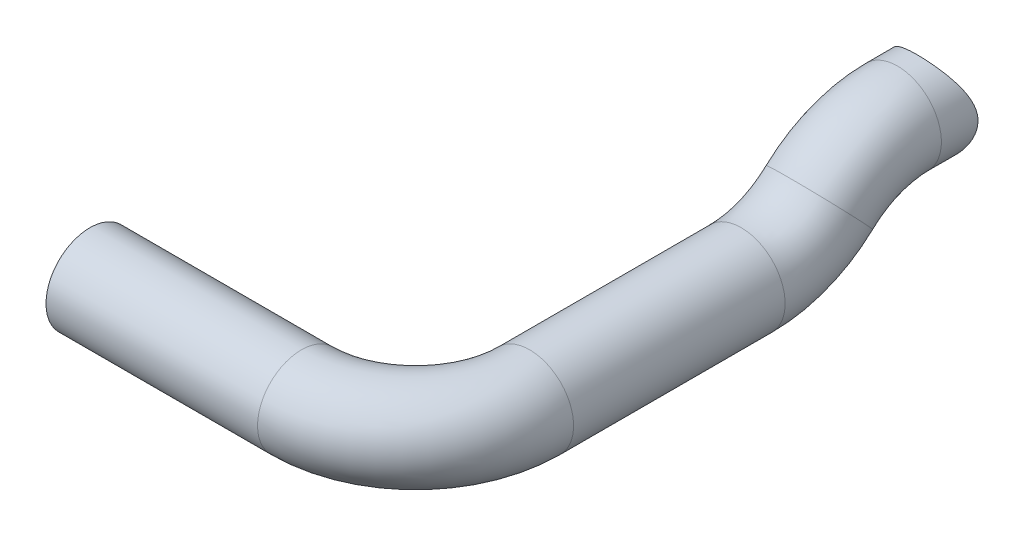
ISO-10303-21;
HEADER;
FILE_DESCRIPTION(('STEP AP214'),'2;1');
FILE_NAME('part.step','',(''),(''),'','','');
FILE_SCHEMA(('AUTOMOTIVE_DESIGN { 1 0 10303 214 1 1 1 1 }'));
ENDSEC;
DATA;
#1=APPLICATION_CONTEXT('core data for automotive mechanical design processes');
#2=APPLICATION_PROTOCOL_DEFINITION('international standard','automotive_design',2000,#1);
#3=PRODUCT_CONTEXT('',#1,'mechanical');
#4=PRODUCT('Part','Part','',(#3));
#5=PRODUCT_RELATED_PRODUCT_CATEGORY('part','',(#4));
#6=PRODUCT_DEFINITION_FORMATION('','',#4);
#7=PRODUCT_DEFINITION_CONTEXT('part definition',#1,'design');
#8=PRODUCT_DEFINITION('design','',#6,#7);
#9=PRODUCT_DEFINITION_SHAPE('','',#8);
#10=(LENGTH_UNIT() NAMED_UNIT(*) SI_UNIT(.MILLI.,.METRE.));
#11=(NAMED_UNIT(*) PLANE_ANGLE_UNIT() SI_UNIT($,.RADIAN.));
#12=(NAMED_UNIT(*) SI_UNIT($,.STERADIAN.) SOLID_ANGLE_UNIT());
#13=UNCERTAINTY_MEASURE_WITH_UNIT(LENGTH_MEASURE(1.E-05),#10,'distance_accuracy_value','');
#14=(GEOMETRIC_REPRESENTATION_CONTEXT(3) GLOBAL_UNCERTAINTY_ASSIGNED_CONTEXT((#13)) GLOBAL_UNIT_ASSIGNED_CONTEXT((#10,
#11,#12)) REPRESENTATION_CONTEXT('',''));
#15=CARTESIAN_POINT('',(0.,0.,0.));
#16=DIRECTION('',(0.,0.,1.));
#17=DIRECTION('',(1.,0.,0.));
#18=AXIS2_PLACEMENT_3D('',#15,#16,#17);
#19=CARTESIAN_POINT('',(114.1966666667,0.913,-12.8));
#20=DIRECTION('',(-1.,0.,0.));
#21=DIRECTION('',(0.,0.,1.));
#22=AXIS2_PLACEMENT_3D('',#19,#20,#21);
#23=PLANE('',#22);
#24=CARTESIAN_POINT('',(114.1966666667,0.913,-12.8));
#25=DIRECTION('',(-1.,0.,0.));
#26=DIRECTION('',(0.,0.,1.));
#27=AXIS2_PLACEMENT_3D('',#24,#25,#26);
#28=CIRCLE('',#27,0.83);
#29=CARTESIAN_POINT('',(114.1966666667,0.913,-11.97));
#30=VERTEX_POINT('',#29);
#31=EDGE_CURVE('E11',#30,#30,#28,.T.);
#32=ORIENTED_EDGE('',*,*,#31,.T.);
#33=EDGE_LOOP('',(#32));
#34=FACE_BOUND('',#33,.T.);
#35=ADVANCED_FACE('F17',(#34),#23,.T.);
#36=CARTESIAN_POINT('',(116.1966666667,0.913,-12.8));
#37=DIRECTION('',(1.,0.,0.));
#38=DIRECTION('',(0.,0.,-1.));
#39=AXIS2_PLACEMENT_3D('',#36,#37,#38);
#40=CYLINDRICAL_SURFACE('',#39,0.83);
#41=CARTESIAN_POINT('',(118.1966666667,0.913,-12.8));
#42=DIRECTION('',(1.,0.,0.));
#43=DIRECTION('',(0.,0.,1.));
#44=AXIS2_PLACEMENT_3D('',#41,#42,#43);
#45=CIRCLE('',#44,0.83);
#46=CARTESIAN_POINT('',(118.1966666667,0.913,-13.63));
#47=VERTEX_POINT('',#46);
#48=CARTESIAN_POINT('',(118.1966666667,0.913,-11.97));
#49=VERTEX_POINT('',#48);
#50=EDGE_CURVE('E129',#47,#49,#45,.T.);
#51=ORIENTED_EDGE('',*,*,#50,.F.);
#52=CARTESIAN_POINT('',(118.1966666667,0.913,-12.8));
#53=DIRECTION('',(1.,0.,0.));
#54=DIRECTION('',(0.,0.,1.));
#55=AXIS2_PLACEMENT_3D('',#52,#53,#54);
#56=CIRCLE('',#55,0.83);
#57=EDGE_CURVE('E92',#49,#47,#56,.T.);
#58=ORIENTED_EDGE('',*,*,#57,.F.);
#59=DIRECTION('',(-1.,0.,0.));
#60=VECTOR('',#59,1.);
#61=CARTESIAN_POINT('',(116.1966666667,0.913,-11.97));
#62=LINE('',#61,#60);
#63=EDGE_CURVE('E28',#49,#30,#62,.T.);
#64=ORIENTED_EDGE('',*,*,#63,.T.);
#65=ORIENTED_EDGE('',*,*,#31,.F.);
#66=ORIENTED_EDGE('',*,*,#63,.F.);
#67=EDGE_LOOP('',(#51,#58,#64,#65,#66));
#68=FACE_BOUND('',#67,.T.);
#69=ADVANCED_FACE('F208',(#68),#40,.T.);
#70=CARTESIAN_POINT('',(118.1966666667,0.913,-14.958));
#71=DIRECTION('',(0.,-1.,0.));
#72=DIRECTION('',(0.,0.,-1.));
#73=AXIS2_PLACEMENT_3D('',#70,#71,#72);
#74=TOROIDAL_SURFACE('',#73,2.158,0.83);
#75=ORIENTED_EDGE('',*,*,#50,.T.);
#76=ORIENTED_EDGE('',*,*,#57,.T.);
#77=CARTESIAN_POINT('',(118.1966666667,0.913,-14.958));
#78=DIRECTION('',(0.,1.,0.));
#79=DIRECTION('',(0.,0.,-1.));
#80=AXIS2_PLACEMENT_3D('',#77,#78,#79);
#81=CIRCLE('',#80,1.328);
#82=CARTESIAN_POINT('',(119.5246666667,0.913,-14.958));
#83=VERTEX_POINT('',#82);
#84=EDGE_CURVE('E86',#47,#83,#81,.T.);
#85=ORIENTED_EDGE('',*,*,#84,.T.);
#86=CARTESIAN_POINT('',(120.3546666667,0.913,-14.958));
#87=DIRECTION('',(0.,0.,1.));
#88=DIRECTION('',(0.,-1.,0.));
#89=AXIS2_PLACEMENT_3D('',#86,#87,#88);
#90=CIRCLE('',#89,0.83);
#91=EDGE_CURVE('E91',#83,#83,#90,.T.);
#92=ORIENTED_EDGE('',*,*,#91,.T.);
#93=ORIENTED_EDGE('',*,*,#84,.F.);
#94=EDGE_LOOP('',(#75,#76,#85,#92,#93));
#95=FACE_BOUND('',#94,.T.);
#96=ADVANCED_FACE('F89',(#95),#74,.T.);
#97=CARTESIAN_POINT('',(120.3546666667,2.253,-23.51274872028));
#98=DIRECTION('',(0.,-1.,0.));
#99=DIRECTION('',(1.,0.,0.));
#100=AXIS2_PLACEMENT_3D('',#97,#98,#99);
#101=CYLINDRICAL_SURFACE('',#100,1.23);
#102=CARTESIAN_POINT('',(121.1846666667,2.083,-22.6050042628472));
#103=CARTESIAN_POINT('',(121.184662738499,2.07622727715432,-22.6050007577028));
#104=CARTESIAN_POINT('',(121.184577446457,2.06945463501066,-22.6049226870863));
#105=CARTESIAN_POINT('',(121.184244006698,2.05592070960233,-22.6046179312059));
#106=CARTESIAN_POINT('',(121.183995955118,2.04915942199302,-22.6043913336718));
#107=CARTESIAN_POINT('',(121.183336708637,2.03564820569884,-22.6037898932005));
#108=CARTESIAN_POINT('',(121.182925436814,2.02889828387882,-22.603414980366));
#109=CARTESIAN_POINT('',(121.181939345694,2.01540978570976,-22.6025177812053));
#110=CARTESIAN_POINT('',(121.181364276818,2.0086712425821,-22.6019952699925));
#111=CARTESIAN_POINT('',(121.180049917689,1.99520547266617,-22.6008039431139));
#112=CARTESIAN_POINT('',(121.179310207016,1.98847832008721,-22.6001347529664));
#113=CARTESIAN_POINT('',(121.177665662846,1.97503528785966,-22.5986514153742));
#114=CARTESIAN_POINT('',(121.176760241325,1.96831953716376,-22.5978367519783));
#115=CARTESIAN_POINT('',(121.174783137237,1.95489925126013,-22.5960640715288));
#116=CARTESIAN_POINT('',(121.173710703525,1.948194912301,-22.5951054075533));
#117=CARTESIAN_POINT('',(121.171398205997,1.93479738182318,-22.5930465933485));
#118=CARTESIAN_POINT('',(121.170157233548,1.92810446494074,-22.5919456778901));
#119=CARTESIAN_POINT('',(121.16750606047,1.91472969360751,-22.5896044913295));
#120=CARTESIAN_POINT('',(121.16609480033,1.90804820154452,-22.5883633511622));
#121=CARTESIAN_POINT('',(121.163101233229,1.89469620931932,-22.5857441162034));
#122=CARTESIAN_POINT('',(121.161517723322,1.88802616704389,-22.5843650644775));
#123=CARTESIAN_POINT('',(121.158177608934,1.87469690816172,-22.5814726671626));
#124=CARTESIAN_POINT('',(121.156419666028,1.86803824991617,-22.5799582937213));
#125=CARTESIAN_POINT('',(121.152728468085,1.85473192222392,-22.5767982327843));
#126=CARTESIAN_POINT('',(121.150793748002,1.84808491836597,-22.5751514646766));
#127=CARTESIAN_POINT('',(121.144691289875,1.82805547256751,-22.569992239328));
#128=CARTESIAN_POINT('',(121.140277162902,1.8147916032615,-22.5663061150422));
#129=CARTESIAN_POINT('',(121.130720528012,1.78830521217411,-22.5584534554028));
#130=CARTESIAN_POINT('',(121.125563627973,1.77509062630949,-22.5542778356859));
#131=CARTESIAN_POINT('',(121.115043057633,1.74997199910789,-22.5459138712868));
#132=CARTESIAN_POINT('',(121.109721660103,1.73804251443689,-22.5417485112607));
#133=CARTESIAN_POINT('',(121.098542346907,1.71445284761345,-22.5331575223316));
#134=CARTESIAN_POINT('',(121.092681885352,1.70279430726449,-22.5287306978764));
#135=CARTESIAN_POINT('',(121.080406025536,1.67974762492704,-22.5196419263023));
#136=CARTESIAN_POINT('',(121.073986962101,1.6683620094978,-22.5149785254689));
#137=CARTESIAN_POINT('',(121.060577999465,1.6458597734096,-22.5054466441507));
#138=CARTESIAN_POINT('',(121.05358338833,1.6347465949399,-22.5005766707068));
#139=CARTESIAN_POINT('',(121.039006246859,1.61278847818065,-22.4906636541279));
#140=CARTESIAN_POINT('',(121.031418025324,1.60194791894653,-22.4856192858947));
#141=CARTESIAN_POINT('',(121.015636793316,1.58053398006205,-22.4753924456989));
#142=CARTESIAN_POINT('',(121.007437207129,1.56996590023425,-22.470209030957));
#143=CARTESIAN_POINT('',(120.990416073294,1.54909638956991,-22.4597416153218));
#144=CARTESIAN_POINT('',(120.981587163957,1.53880114805437,-22.4544572546356));
#145=CARTESIAN_POINT('',(120.963292115017,1.51847505502236,-22.4438292784455));
#146=CARTESIAN_POINT('',(120.95381796552,1.50845119501628,-22.4384860910602));
#147=CARTESIAN_POINT('',(120.934588677857,1.48905210905555,-22.4279869910927));
#148=CARTESIAN_POINT('',(120.92484371534,1.47966765012313,-22.4228295074776));
#149=CARTESIAN_POINT('',(120.904980053891,1.46144680495024,-22.412667659864));
#150=CARTESIAN_POINT('',(120.894866016134,1.45260590867605,-22.4076622849197));
#151=CARTESIAN_POINT('',(120.874264432493,1.43547033523907,-22.3978283800792));
#152=CARTESIAN_POINT('',(120.863780705437,1.42717171733517,-22.3929987233987));
#153=CARTESIAN_POINT('',(120.842439506452,1.41112046320415,-22.3835397229102));
#154=CARTESIAN_POINT('',(120.831585001239,1.4033645481837,-22.3789092559178));
#155=CARTESIAN_POINT('',(120.809503447048,1.38839795479816,-22.3698729170965));
#156=CARTESIAN_POINT('',(120.798278511178,1.38118476457143,-22.3654660458427));
#157=CARTESIAN_POINT('',(120.775458424538,1.3673026770146,-22.3569016949751));
#158=CARTESIAN_POINT('',(120.76386456122,1.36063212554913,-22.3527434685358));
#159=CARTESIAN_POINT('',(120.740309772011,1.34783507428076,-22.3447016132237));
#160=CARTESIAN_POINT('',(120.728349363107,1.34170785173828,-22.3408176210088));
#161=CARTESIAN_POINT('',(120.704067303438,1.32999409842493,-22.3333503034321));
#162=CARTESIAN_POINT('',(120.69174547889,1.32440783351023,-22.3297671260212));
#163=CARTESIAN_POINT('',(120.666387093487,1.3136330522085,-22.3228291982943));
#164=CARTESIAN_POINT('',(120.653340206666,1.30846206790269,-22.3194848718243));
#165=CARTESIAN_POINT('',(120.62707598728,1.29881875934116,-22.3132183039905));
#166=CARTESIAN_POINT('',(120.613862530485,1.29433885341835,-22.3102915134781));
#167=CARTESIAN_POINT('',(120.587280220923,1.28607408001756,-22.3048691219107));
#168=CARTESIAN_POINT('',(120.573914164119,1.2822828254624,-22.3023695726246));
#169=CARTESIAN_POINT('',(120.547041320557,1.27539483343817,-22.2978099062529));
#170=CARTESIAN_POINT('',(120.533536369876,1.27229304680117,-22.2957466002724));
#171=CARTESIAN_POINT('',(120.506399533116,1.26678228996935,-22.2920671145426));
#172=CARTESIAN_POINT('',(120.492768684954,1.26436976975754,-22.2904486453952));
#173=CARTESIAN_POINT('',(120.472228875233,1.26126781149581,-22.2883605513411));
#174=CARTESIAN_POINT('',(120.465374709357,1.2603207648323,-22.2877216681485));
#175=CARTESIAN_POINT('',(120.451640496506,1.25859890773446,-22.2865580668812));
#176=CARTESIAN_POINT('',(120.444760474643,1.25782396001564,-22.2860332578159));
#177=CARTESIAN_POINT('',(120.430976745093,1.25644627377112,-22.2850987359102));
#178=CARTESIAN_POINT('',(120.42407304194,1.25584350395306,-22.2846890021558));
#179=CARTESIAN_POINT('',(120.410243808919,1.25481004273476,-22.2839854654631));
#180=CARTESIAN_POINT('',(120.403318270815,1.25437942680908,-22.2836917133734));
#181=CARTESIAN_POINT('',(120.389447342799,1.25369018562161,-22.2832209605632));
#182=CARTESIAN_POINT('',(120.382501939645,1.25343174254602,-22.2830440835166));
#183=CARTESIAN_POINT('',(120.368593255295,1.25308668799531,-22.282807864893));
#184=CARTESIAN_POINT('',(120.361629963621,1.25300036445989,-22.2827487202714));
#185=CARTESIAN_POINT('',(120.347707179227,1.2529996357395,-22.2827487202886));
#186=CARTESIAN_POINT('',(120.340747686513,1.25308513652806,-22.2828078002321));
#187=CARTESIAN_POINT('',(120.32684609043,1.25342871637572,-22.2830437695672));
#188=CARTESIAN_POINT('',(120.319903977049,1.25368651931215,-22.2832204704637));
#189=CARTESIAN_POINT('',(120.306039115979,1.25437454864215,-22.2836907772086));
#190=CARTESIAN_POINT('',(120.299116355956,1.25480460512739,-22.2839842678556));
#191=CARTESIAN_POINT('',(120.285292164867,1.25583704287845,-22.2846872140318));
#192=CARTESIAN_POINT('',(120.278390726934,1.2564393611562,-22.2850966271731));
#193=CARTESIAN_POINT('',(120.264611012768,1.25781623218053,-22.2860304662432));
#194=CARTESIAN_POINT('',(120.257732742898,1.25859082886507,-22.2865549215118));
#195=CARTESIAN_POINT('',(120.244001518871,1.26031207378393,-22.2877177995413));
#196=CARTESIAN_POINT('',(120.237148592142,1.2612588720196,-22.2883563216549));
#197=CARTESIAN_POINT('',(120.21661096773,1.26436033270483,-22.2904434242032));
#198=CARTESIAN_POINT('',(120.202981071086,1.26677269856537,-22.2920612510749));
#199=CARTESIAN_POINT('',(120.175844089427,1.27228345807035,-22.2957396633045));
#200=CARTESIAN_POINT('',(120.162338071467,1.27538550160475,-22.2978026024895));
#201=CARTESIAN_POINT('',(120.135461062737,1.28227429743277,-22.3023619508195));
#202=CARTESIAN_POINT('',(120.122091942902,1.28606619439274,-22.3048616108961));
#203=CARTESIAN_POINT('',(120.095501553478,1.29433263843403,-22.3102848279949));
#204=CARTESIAN_POINT('',(120.082283119776,1.29881366268745,-22.3132123924197));
#205=CARTESIAN_POINT('',(120.056006913874,1.30845925770099,-22.3194813417358));
#206=CARTESIAN_POINT('',(120.042953059197,1.31363148890348,-22.3228273324207));
#207=CARTESIAN_POINT('',(120.017593941168,1.32440395423002,-22.3297654608887));
#208=CARTESIAN_POINT('',(120.005278007041,1.32998606693743,-22.3333468236095));
#209=CARTESIAN_POINT('',(119.981005982117,1.34169284113131,-22.3408106488021));
#210=CARTESIAN_POINT('',(119.969049769743,1.34781731649087,-22.3446930079222));
#211=CARTESIAN_POINT('',(119.945501527309,1.36060985943175,-22.3527319434112));
#212=CARTESIAN_POINT('',(119.933910071433,1.3672787299485,-22.3568889230343));
#213=CARTESIAN_POINT('',(119.911093034363,1.3811585313094,-22.3654512803113));
#214=CARTESIAN_POINT('',(119.899868801731,1.38837119513094,-22.3698574398624));
#215=CARTESIAN_POINT('',(119.877786935627,1.40333779375588,-22.3788930097377));
#216=CARTESIAN_POINT('',(119.866931479133,1.41109431637353,-22.3835234497283));
#217=CARTESIAN_POINT('',(119.845586708887,1.42714783654603,-22.3929832010466));
#218=CARTESIAN_POINT('',(119.835100427208,1.43544818472385,-22.3978136612137));
#219=CARTESIAN_POINT('',(119.814492180554,1.45258833673565,-22.4076500850625));
#220=CARTESIAN_POINT('',(119.804374100425,1.46143214859888,-22.4126571967552));
#221=CARTESIAN_POINT('',(119.784500685165,1.47965970571503,-22.4228236556396));
#222=CARTESIAN_POINT('',(119.774750074664,1.48904802042013,-22.4279840322101));
#223=CARTESIAN_POINT('',(119.755519706507,1.5084454113999,-22.4384837222598));
#224=CARTESIAN_POINT('',(119.746049640223,1.51846328228663,-22.4438245332747));
#225=CARTESIAN_POINT('',(119.727761547234,1.53877921645438,-22.4544481766124));
#226=CARTESIAN_POINT('',(119.718935576592,1.5490703419852,-22.4597305898889));
#227=CARTESIAN_POINT('',(119.701918962942,1.56993318449872,-22.4701947525857));
#228=CARTESIAN_POINT('',(119.693721031642,1.58049877267444,-22.4753768602515));
#229=CARTESIAN_POINT('',(119.677941853983,1.60190935460306,-22.4856018016607));
#230=CARTESIAN_POINT('',(119.670354108203,1.6127491094917,-22.490645568166));
#231=CARTESIAN_POINT('',(119.655776703292,1.63470722894701,-22.5005581884706));
#232=CARTESIAN_POINT('',(119.648781432193,1.64582127554875,-22.5054283487157));
#233=CARTESIAN_POINT('',(119.635369967833,1.66832685226189,-22.5149614981666));
#234=CARTESIAN_POINT('',(119.628949143688,1.67971499973016,-22.5196259536809));
#235=CARTESIAN_POINT('',(119.616668686102,1.70276839603688,-22.5287177429791));
#236=CARTESIAN_POINT('',(119.610805468621,1.71443117456393,-22.5331464972291));
#237=CARTESIAN_POINT('',(119.599619372468,1.73803080639419,-22.5417424913716));
#238=CARTESIAN_POINT('',(119.594294028877,1.74996607033578,-22.5459108873813));
#239=CARTESIAN_POINT('',(119.583769790401,1.77508715619473,-22.5542777682855));
#240=CARTESIAN_POINT('',(119.578612743015,1.78829817085851,-22.5584535082679));
#241=CARTESIAN_POINT('',(119.569055995628,1.81477854142173,-22.5663062571546));
#242=CARTESIAN_POINT('',(119.564641926565,1.82803997149858,-22.5699923377255));
#243=CARTESIAN_POINT('',(119.558539571431,1.84806614486911,-22.5751514767238));
#244=CARTESIAN_POINT('',(119.556604850291,1.85471227849543,-22.5767982457775));
#245=CARTESIAN_POINT('',(119.55291365021,1.86801711545499,-22.5799583082841));
#246=CARTESIAN_POINT('',(119.551155710613,1.87467515509582,-22.5814726791753));
#247=CARTESIAN_POINT('',(119.547815597,1.88800342233464,-22.5843650757862));
#248=CARTESIAN_POINT('',(119.546232089313,1.89467309350818,-22.5857441257516));
#249=CARTESIAN_POINT('',(119.543238521957,1.90802459018349,-22.5883633608383));
#250=CARTESIAN_POINT('',(119.541827264378,1.914705959694,-22.5896044989162));
#251=CARTESIAN_POINT('',(119.539176091055,1.9280807323322,-22.5919456856248));
#252=CARTESIAN_POINT('',(119.537935121111,1.93477377488705,-22.5930465989827));
#253=CARTESIAN_POINT('',(119.535622623067,1.94817180329024,-22.5951054135822));
#254=CARTESIAN_POINT('',(119.534550191884,1.95487651618914,-22.5960640753908));
#255=CARTESIAN_POINT('',(119.532573087075,1.96829779667136,-22.5978367564356));
#256=CARTESIAN_POINT('',(119.531667668054,1.9750141695227,-22.5986514176486));
#257=CARTESIAN_POINT('',(119.530023122928,1.98845869295014,-22.600134756064));
#258=CARTESIAN_POINT('',(119.529283414703,1.99518671588278,-22.6008039440407));
#259=CARTESIAN_POINT('',(119.527969054373,2.00865447360196,-22.6019952719814));
#260=CARTESIAN_POINT('',(119.527393987856,2.01539413525102,-22.6025177810764));
#261=CARTESIAN_POINT('',(119.526407895277,2.02888511784257,-22.6034149815492));
#262=CARTESIAN_POINT('',(119.525996625696,2.03563640637649,-22.6037898923539));
#263=CARTESIAN_POINT('',(119.525337377463,2.04915060360872,-22.6043913344143));
#264=CARTESIAN_POINT('',(119.525089327946,2.05591350598424,-22.6046179300638));
#265=CARTESIAN_POINT('',(119.524755886186,2.06945090921855,-22.6049226877835));
#266=CARTESIAN_POINT('',(119.524670596072,2.07622541469179,-22.6050007566542));
#267=CARTESIAN_POINT('',(119.5246666667,2.083,-22.6050042628472));
#268=B_SPLINE_CURVE_WITH_KNOTS('',3,(#102,#103,#104,#105,#106,#107,#108,#109,#110,#111,#112,
#113,#114,#115,#116,#117,#118,#119,#120,#121,#122,#123,#124,#125,#126,#127,#128,#129,#130,#131,
#132,#133,#134,#135,#136,#137,#138,#139,#140,#141,#142,#143,#144,#145,#146,#147,#148,#149,#150,
#151,#152,#153,#154,#155,#156,#157,#158,#159,#160,#161,#162,#163,#164,#165,#166,#167,#168,#169,
#170,#171,#172,#173,#174,#175,#176,#177,#178,#179,#180,#181,#182,#183,#184,#185,#186,#187,#188,
#189,#190,#191,#192,#193,#194,#195,#196,#197,#198,#199,#200,#201,#202,#203,#204,#205,#206,#207,
#208,#209,#210,#211,#212,#213,#214,#215,#216,#217,#218,#219,#220,#221,#222,#223,#224,#225,#226,
#227,#228,#229,#230,#231,#232,#233,#234,#235,#236,#237,#238,#239,#240,#241,#242,#243,#244,#245,
#246,#247,#248,#249,#250,#251,#252,#253,#254,#255,#256,#257,#258,#259,#260,#261,#262,#263,#264,
#265,#266,#267),.UNSPECIFIED.,.F.,.F.,(4,2,2,2,2,2,2,2,2,2,2,2,2,2,2,2,2,2,2,2,2,2,2,2,2,2,2,2,
2,2,2,2,2,2,2,2,2,2,2,2,2,2,2,2,2,2,2,2,2,2,2,2,2,2,2,2,2,2,2,2,2,2,2,2,2,2,2,2,2,2,2,2,2,2,2,2,
2,2,2,2,2,2,4),(0.,0.0203172853951433,0.0406225808543785,0.0609374571176121,0.0812834544396311,
0.101682014468094,0.122154413672784,0.142721699338215,0.163404629040172,0.184223614405958,
0.205198669815477,0.226349366543781,0.2476947926841,0.291039092767625,0.335378203066585,
0.376494561849897,0.417816190623161,0.459433004044502,0.501433019017414,0.543901867839763,
0.586922381027245,0.630574246469738,0.674933747228691,0.718355386924496,0.761346686602122,
0.803979416461927,0.846327169589844,0.888465031966641,0.930469214920212,0.972416658137094,
1.01438461309614,1.05764416668922,1.10038894094504,1.14271439750417,1.18471885699325,
1.22650290607784,1.24734649599337,1.26817339863005,1.28899651368263,1.30982874788179,
1.3306829910266,1.35157209217365,1.37244976540769,1.39329406110997,1.41411784674415,
1.43493402780879,1.45575552394277,1.47659524489979,1.51837619412749,1.56038375350566,
1.60271848773141,1.64547865318787,1.68875960891847,1.73070563696012,1.77263732542415,
1.814632017381,1.8567667092164,1.89911763399737,1.94175986535468,1.98476695166551,
2.02821058852639,2.07254748625357,2.116183129448,2.1591938787949,2.20165946867007,
2.24366274059836,2.2852892986819,2.32662708958965,2.36776591402356,2.41209569230249,
2.45543315053173,2.47677613920797,2.49792507590188,2.51889906465823,2.53971769120679,
2.56040098269082,2.58096936162818,2.6014435944498,2.62184473512143,2.64219406451057,
2.66251302630252,2.68282316038901,2.70314603474341),.UNSPECIFIED.);
#269=CARTESIAN_POINT('',(121.1846666667,2.083,-22.60500426285));
#270=VERTEX_POINT('',#269);
#271=CARTESIAN_POINT('',(119.5246666667,2.083,-22.6050042628472));
#272=VERTEX_POINT('',#271);
#273=EDGE_CURVE('E184',#270,#272,#268,.T.);
#274=ORIENTED_EDGE('',*,*,#273,.T.);
#275=CARTESIAN_POINT('',(119.5246666667,2.083,-22.6050042628472));
#276=CARTESIAN_POINT('',(119.524670594901,2.08977272284571,-22.6050007577027));
#277=CARTESIAN_POINT('',(119.524755886943,2.0965453649894,-22.6049226870861));
#278=CARTESIAN_POINT('',(119.525089326702,2.11007929039779,-22.6046179312054));
#279=CARTESIAN_POINT('',(119.525337378283,2.11684057800713,-22.6043913336712));
#280=CARTESIAN_POINT('',(119.525996624764,2.13035179430136,-22.6037898931998));
#281=CARTESIAN_POINT('',(119.526407896587,2.1371017161214,-22.6034149803652));
#282=CARTESIAN_POINT('',(119.527393987707,2.15059021429051,-22.6025177812044));
#283=CARTESIAN_POINT('',(119.527969056583,2.15732875741818,-22.6019952699914));
#284=CARTESIAN_POINT('',(119.529283415713,2.17079452733414,-22.6008039431127));
#285=CARTESIAN_POINT('',(119.530023126385,2.17752167991312,-22.6001347529652));
#286=CARTESIAN_POINT('',(119.531667670555,2.1909647121407,-22.598651415373));
#287=CARTESIAN_POINT('',(119.532573092076,2.19768046283661,-22.597836751977));
#288=CARTESIAN_POINT('',(119.534550196164,2.21110074874026,-22.5960640715274));
#289=CARTESIAN_POINT('',(119.535622629876,2.21780508769939,-22.5951054075519));
#290=CARTESIAN_POINT('',(119.537935127405,2.23120261817722,-22.5930465933471));
#291=CARTESIAN_POINT('',(119.539176099854,2.23789553505966,-22.5919456778887));
#292=CARTESIAN_POINT('',(119.541827272932,2.25127030639289,-22.5896044913281));
#293=CARTESIAN_POINT('',(119.543238533072,2.25795179845587,-22.5883633511608));
#294=CARTESIAN_POINT('',(119.546232100172,2.27130379068107,-22.585744116202));
#295=CARTESIAN_POINT('',(119.54781561008,2.27797383295649,-22.5843650644762));
#296=CARTESIAN_POINT('',(119.551155724467,2.29130309183865,-22.5814726671613));
#297=CARTESIAN_POINT('',(119.552913667374,2.29796175008418,-22.57995829372));
#298=CARTESIAN_POINT('',(119.556604865317,2.31126807777641,-22.5767982327832));
#299=CARTESIAN_POINT('',(119.5585395854,2.31791508163434,-22.5751514646755));
#300=CARTESIAN_POINT('',(119.564642043526,2.33794452743273,-22.5699922393271));
#301=CARTESIAN_POINT('',(119.569056170499,2.35120839673869,-22.5663061150414));
#302=CARTESIAN_POINT('',(119.578612805389,2.377694787826,-22.5584534554024));
#303=CARTESIAN_POINT('',(119.583769705427,2.39090937369059,-22.5542778356857));
#304=CARTESIAN_POINT('',(119.594290275765,2.41602800088793,-22.5459138712883));
#305=CARTESIAN_POINT('',(119.599611673293,2.42795748555479,-22.5417485112637));
#306=CARTESIAN_POINT('',(119.610790986485,2.45154715237115,-22.5331575223372));
#307=CARTESIAN_POINT('',(119.616651448039,2.46320569271712,-22.5287306978829));
#308=CARTESIAN_POINT('',(119.628927307853,2.48625237504982,-22.5196419263105));
#309=CARTESIAN_POINT('',(119.635346371287,2.49763799047727,-22.5149785254776));
#310=CARTESIAN_POINT('',(119.648755333921,2.5201402265631,-22.50544664416));
#311=CARTESIAN_POINT('',(119.655749945057,2.53125340503219,-22.5005766707162));
#312=CARTESIAN_POINT('',(119.670327086527,2.55321152179142,-22.4906636541372));
#313=CARTESIAN_POINT('',(119.677915308062,2.56405208102612,-22.4856192859036));
#314=CARTESIAN_POINT('',(119.693696540071,2.58546601991297,-22.4753924457068));
#315=CARTESIAN_POINT('',(119.701896126259,2.59603409974253,-22.4702090309643));
#316=CARTESIAN_POINT('',(119.718917260096,2.61690361041158,-22.4597416153274));
#317=CARTESIAN_POINT('',(119.727746169435,2.62719885193003,-22.4544572546402));
#318=CARTESIAN_POINT('',(119.746041218379,2.64752494496925,-22.4438292784479));
#319=CARTESIAN_POINT('',(119.755515367878,2.65754880497959,-22.4384860910615));
#320=CARTESIAN_POINT('',(119.774744655538,2.67694789094133,-22.4279869910954));
#321=CARTESIAN_POINT('',(119.78448961805,2.6863323498708,-22.4228295074829));
#322=CARTESIAN_POINT('',(119.80435327949,2.70455319503854,-22.4126676598734));
#323=CARTESIAN_POINT('',(119.814467317243,2.71339409131048,-22.4076622849307));
#324=CARTESIAN_POINT('',(119.835068900878,2.73052966474393,-22.3978283800925));
#325=CARTESIAN_POINT('',(119.845552627932,2.7388282826465,-22.3929987234127));
#326=CARTESIAN_POINT('',(119.866893826914,2.75487953677578,-22.3835397229249));
#327=CARTESIAN_POINT('',(119.877748332126,2.76263545179576,-22.3789092559324));
#328=CARTESIAN_POINT('',(119.899829886317,2.77760204518129,-22.3698729171104));
#329=CARTESIAN_POINT('',(119.911054822187,2.78481523540843,-22.365466045856));
#330=CARTESIAN_POINT('',(119.93387490883,2.79869732296702,-22.3569016949866));
#331=CARTESIAN_POINT('',(119.94546877215,2.80536787443377,-22.3527434685462));
#332=CARTESIAN_POINT('',(119.969023561366,2.81816492570562,-22.3447016132315));
#333=CARTESIAN_POINT('',(119.980983970273,2.82429214825023,-22.340817621015));
#334=CARTESIAN_POINT('',(120.005266029951,2.83600590156892,-22.3333503034352));
#335=CARTESIAN_POINT('',(120.017587854504,2.84159216648677,-22.3297671260227));
#336=CARTESIAN_POINT('',(120.042946239911,2.85236694779145,-22.3228291982948));
#337=CARTESIAN_POINT('',(120.05599312673,2.8575379320974,-22.3194848718252));
#338=CARTESIAN_POINT('',(120.082257346113,2.86718124065907,-22.3132183039921));
#339=CARTESIAN_POINT('',(120.095470802907,2.87166114658186,-22.3102915134799));
#340=CARTESIAN_POINT('',(120.122053112467,2.87992591998266,-22.3048691219126));
#341=CARTESIAN_POINT('',(120.13541916927,2.88371717453783,-22.3023695726267));
#342=CARTESIAN_POINT('',(120.162292012831,2.89060516656209,-22.2978099062548));
#343=CARTESIAN_POINT('',(120.175796963512,2.89370695319907,-22.2957466002742));
#344=CARTESIAN_POINT('',(120.202933800272,2.89921771003089,-22.2920671145442));
#345=CARTESIAN_POINT('',(120.216564648434,2.90163023024269,-22.2904486453966));
#346=CARTESIAN_POINT('',(120.237104458156,2.90473218850437,-22.2883605513422));
#347=CARTESIAN_POINT('',(120.243958624032,2.90567923516788,-22.2877216681495));
#348=CARTESIAN_POINT('',(120.257692836884,2.90740109226571,-22.286558066882));
#349=CARTESIAN_POINT('',(120.264572858747,2.90817603998452,-22.2860332578166));
#350=CARTESIAN_POINT('',(120.278356588298,2.90955372622902,-22.2850987359108));
#351=CARTESIAN_POINT('',(120.285260291451,2.91015649604708,-22.2846890021563));
#352=CARTESIAN_POINT('',(120.299089524474,2.91118995726535,-22.2839854654634));
#353=CARTESIAN_POINT('',(120.306015062579,2.91162057319101,-22.2836917133736));
#354=CARTESIAN_POINT('',(120.319885990596,2.91230981437847,-22.2832209605633));
#355=CARTESIAN_POINT('',(120.326831393752,2.91256825745404,-22.2830440835167));
#356=CARTESIAN_POINT('',(120.340740078103,2.91291331200472,-22.282807864893));
#357=CARTESIAN_POINT('',(120.347703369778,2.91299963554012,-22.2827487202714));
#358=CARTESIAN_POINT('',(120.361626154175,2.9130003642605,-22.2827487202886));
#359=CARTESIAN_POINT('',(120.368585646891,2.91291486347192,-22.2828078002321));
#360=CARTESIAN_POINT('',(120.382487242978,2.91257128362422,-22.2830437695674));
#361=CARTESIAN_POINT('',(120.389429356361,2.91231348068779,-22.2832204704639));
#362=CARTESIAN_POINT('',(120.403294217435,2.91162545135776,-22.2836907772091));
#363=CARTESIAN_POINT('',(120.410216977459,2.91119539487251,-22.2839842678562));
#364=CARTESIAN_POINT('',(120.424041168551,2.91016295712143,-22.2846872140328));
#365=CARTESIAN_POINT('',(120.430942606485,2.90956063884367,-22.2850966271743));
#366=CARTESIAN_POINT('',(120.444722320654,2.90818376781933,-22.2860304662447));
#367=CARTESIAN_POINT('',(120.451600590524,2.90740917113478,-22.2865549215136));
#368=CARTESIAN_POINT('',(120.465331814553,2.90568792621591,-22.2877177995435));
#369=CARTESIAN_POINT('',(120.472184741283,2.90474112798024,-22.2883563216572));
#370=CARTESIAN_POINT('',(120.492722365696,2.90163966729507,-22.2904434242062));
#371=CARTESIAN_POINT('',(120.50635226234,2.89922730143455,-22.2920612510782));
#372=CARTESIAN_POINT('',(120.533489244,2.89371654192957,-22.2957396633084));
#373=CARTESIAN_POINT('',(120.546995261959,2.8906144983952,-22.2978026024936));
#374=CARTESIAN_POINT('',(120.573872270687,2.88372570256718,-22.3023619508237));
#375=CARTESIAN_POINT('',(120.58724139052,2.87993380560723,-22.3048616109003));
#376=CARTESIAN_POINT('',(120.613831779939,2.871667361566,-22.3102848279987));
#377=CARTESIAN_POINT('',(120.627050213639,2.86718633731267,-22.313212392423));
#378=CARTESIAN_POINT('',(120.653326419533,2.85754074229905,-22.3194813417378));
#379=CARTESIAN_POINT('',(120.666380274207,2.85236851109644,-22.3228273324217));
#380=CARTESIAN_POINT('',(120.691739392236,2.84159604576699,-22.3297654608896));
#381=CARTESIAN_POINT('',(120.704055326366,2.83601393305644,-22.3333468236114));
#382=CARTESIAN_POINT('',(120.728327351296,2.82430715885731,-22.3408106488061));
#383=CARTESIAN_POINT('',(120.740283563672,2.81818268349567,-22.3446930079271));
#384=CARTESIAN_POINT('',(120.76383180611,2.8053901405514,-22.3527319434178));
#385=CARTESIAN_POINT('',(120.775423261987,2.79872127003337,-22.3568889230415));
#386=CARTESIAN_POINT('',(120.798240299058,2.78484146867076,-22.3654512803197));
#387=CARTESIAN_POINT('',(120.809464531691,2.77762880484881,-22.3698574398712));
#388=CARTESIAN_POINT('',(120.831546397796,2.76266220622388,-22.3788930097469));
#389=CARTESIAN_POINT('',(120.842401854289,2.75490568360668,-22.3835234497375));
#390=CARTESIAN_POINT('',(120.863746624533,2.73885216343589,-22.3929832010555));
#391=CARTESIAN_POINT('',(120.87423290621,2.73055181525939,-22.3978136612221));
#392=CARTESIAN_POINT('',(120.89484115286,2.71341166325102,-22.4076500850695));
#393=CARTESIAN_POINT('',(120.904959232987,2.70456785138995,-22.4126571967612));
#394=CARTESIAN_POINT('',(120.924832648241,2.68634029427895,-22.4228236556429));
#395=CARTESIAN_POINT('',(120.934583258739,2.6769519795769,-22.4279840322118));
#396=CARTESIAN_POINT('',(120.953813626888,2.65755458860531,-22.4384837222569));
#397=CARTESIAN_POINT('',(120.963283693166,2.64753671772383,-22.4438245332687));
#398=CARTESIAN_POINT('',(120.981571786147,2.62722078356511,-22.4544481766008));
#399=CARTESIAN_POINT('',(120.990397756785,2.61692965803802,-22.4597305898749));
#400=CARTESIAN_POINT('',(121.007414370429,2.59606681553051,-22.4701947525676));
#401=CARTESIAN_POINT('',(121.015612301727,2.58550122735701,-22.4753768602317));
#402=CARTESIAN_POINT('',(121.031391479384,2.56409064543141,-22.4856018016385));
#403=CARTESIAN_POINT('',(121.038979225163,2.55325089054349,-22.490645568143));
#404=CARTESIAN_POINT('',(121.053556630074,2.53129277108818,-22.5005581884472));
#405=CARTESIAN_POINT('',(121.060551901174,2.52017872448567,-22.5054283486925));
#406=CARTESIAN_POINT('',(121.073963365537,2.49767314776954,-22.514961498145));
#407=CARTESIAN_POINT('',(121.080384189684,2.48628500029901,-22.5196259536606));
#408=CARTESIAN_POINT('',(121.092664647276,2.46323160398626,-22.5287177429626));
#409=CARTESIAN_POINT('',(121.098527864761,2.45156882545539,-22.5331464972151));
#410=CARTESIAN_POINT('',(121.109713960922,2.42796919361624,-22.5417424913639));
#411=CARTESIAN_POINT('',(121.115039304518,2.41603392966954,-22.5459108873775));
#412=CARTESIAN_POINT('',(121.125563542999,2.39091284381148,-22.5542777682856));
#413=CARTESIAN_POINT('',(121.130720590385,2.37770182915399,-22.5584535082685));
#414=CARTESIAN_POINT('',(121.140277337773,2.35122145860141,-22.5663062571556));
#415=CARTESIAN_POINT('',(121.144691406836,2.33796002852889,-22.5699923377266));
#416=CARTESIAN_POINT('',(121.15079376197,2.31793385516414,-22.5751514767249));
#417=CARTESIAN_POINT('',(121.15272848311,2.31128772153936,-22.5767982457787));
#418=CARTESIAN_POINT('',(121.156419683192,2.29798288458244,-22.5799583082854));
#419=CARTESIAN_POINT('',(121.158177622789,2.29132484494271,-22.5814726791766));
#420=CARTESIAN_POINT('',(121.161517736402,2.27799657770564,-22.5843650757876));
#421=CARTESIAN_POINT('',(121.163101244088,2.27132690653276,-22.585744125753));
#422=CARTESIAN_POINT('',(121.166094811445,2.25797540985833,-22.5883633608397));
#423=CARTESIAN_POINT('',(121.167506069024,2.25129404034803,-22.5896044989177));
#424=CARTESIAN_POINT('',(121.170157242347,2.23791926770983,-22.5919456856263));
#425=CARTESIAN_POINT('',(121.17139821229,2.23122622515476,-22.5930465989841));
#426=CARTESIAN_POINT('',(121.173710710335,2.21782819675069,-22.5951054135837));
#427=CARTESIAN_POINT('',(121.174783141518,2.21112348385113,-22.5960640753922));
#428=CARTESIAN_POINT('',(121.176760246326,2.19770220336714,-22.5978367564369));
#429=CARTESIAN_POINT('',(121.177665665348,2.1909858305147,-22.5986514176499));
#430=CARTESIAN_POINT('',(121.179310210474,2.17754130708462,-22.6001347560652));
#431=CARTESIAN_POINT('',(121.180049918698,2.17081328415044,-22.6008039440418));
#432=CARTESIAN_POINT('',(121.181364279029,2.15734552642774,-22.6019952719824));
#433=CARTESIAN_POINT('',(121.181939345545,2.1506058647767,-22.6025177810774));
#434=CARTESIAN_POINT('',(121.182925438124,2.13711488218075,-22.60341498155));
#435=CARTESIAN_POINT('',(121.183336707705,2.1303635936444,-22.6037898923546));
#436=CARTESIAN_POINT('',(121.183995955937,2.1168493964069,-22.6043913344149));
#437=CARTESIAN_POINT('',(121.184244005454,2.11008649402852,-22.6046179300643));
#438=CARTESIAN_POINT('',(121.184577447214,2.09654909078805,-22.6049226877838));
#439=CARTESIAN_POINT('',(121.184662737328,2.0897745853115,-22.6050007566543));
#440=CARTESIAN_POINT('',(121.1846666667,2.083,-22.6050042628472));
#441=B_SPLINE_CURVE_WITH_KNOTS('',3,(#275,#276,#277,#278,#279,#280,#281,#282,#283,#284,#285,
#286,#287,#288,#289,#290,#291,#292,#293,#294,#295,#296,#297,#298,#299,#300,#301,#302,#303,#304,
#305,#306,#307,#308,#309,#310,#311,#312,#313,#314,#315,#316,#317,#318,#319,#320,#321,#322,#323,
#324,#325,#326,#327,#328,#329,#330,#331,#332,#333,#334,#335,#336,#337,#338,#339,#340,#341,#342,
#343,#344,#345,#346,#347,#348,#349,#350,#351,#352,#353,#354,#355,#356,#357,#358,#359,#360,#361,
#362,#363,#364,#365,#366,#367,#368,#369,#370,#371,#372,#373,#374,#375,#376,#377,#378,#379,#380,
#381,#382,#383,#384,#385,#386,#387,#388,#389,#390,#391,#392,#393,#394,#395,#396,#397,#398,#399,
#400,#401,#402,#403,#404,#405,#406,#407,#408,#409,#410,#411,#412,#413,#414,#415,#416,#417,#418,
#419,#420,#421,#422,#423,#424,#425,#426,#427,#428,#429,#430,#431,#432,#433,#434,#435,#436,#437,
#438,#439,#440),.UNSPECIFIED.,.F.,.F.,(4,2,2,2,2,2,2,2,2,2,2,2,2,2,2,2,2,2,2,2,2,2,2,2,2,2,2,2,
2,2,2,2,2,2,2,2,2,2,2,2,2,2,2,2,2,2,2,2,2,2,2,2,2,2,2,2,2,2,2,2,2,2,2,2,2,2,2,2,2,2,2,2,2,2,2,2,
2,2,2,2,2,2,4),(0.,0.0203172853952465,0.0406225808545857,0.0609374571179179,0.0812834544400295,
0.101682014468572,0.122154413673321,0.142721699338793,0.163404629040763,0.184223614406536,
0.205198669816006,0.226349366544224,0.247694792684416,0.291039092767558,0.335378203065941,
0.376494561834749,0.417816190597659,0.459433004012798,0.501433018983652,0.543901867808045,
0.586922381001613,0.630574246454149,0.674933747227014,0.718355386904025,0.76134668656814,
0.803979416419772,0.846327169544954,0.888465031924497,0.930469214886292,0.972416658116856,
1.01438461309502,1.0576441666829,1.10038894093496,1.14271439749177,1.18471885698008,
1.22650290606545,1.24734649598197,1.26817339862003,1.28899651367441,1.30982874787575,
1.33068299102315,1.35157209217319,1.37244976541364,1.39329406112144,1.4141178467603,
1.43493402782876,1.45575552396571,1.47659524492483,1.51837619415422,1.56038375353074,
1.60271848775155,1.64547865319992,1.68875960891936,1.7307056369744,1.77263732544812,
1.81463201741085,1.85676670924822,1.8991176340272,1.94175986537854,1.9847669516794,
2.02821058852629,2.07254748622927,2.11618312940646,2.15919387874305,2.2016594686148,
2.24366274054648,2.28528929864008,2.32662708956435,2.36776591402105,2.41209569228387,
2.45543315050126,2.47677613917327,2.49792507586412,2.5188990646186,2.53971769116654,
2.5604009826512,2.58096936159048,2.60144359441532,2.62184473509148,2.64219406448649,
2.66251302628564,2.68282316038068,2.70314603474497),.UNSPECIFIED.);
#442=EDGE_CURVE('E131',#272,#270,#441,.T.);
#443=ORIENTED_EDGE('',*,*,#442,.T.);
#444=EDGE_LOOP('',(#274,#443));
#445=FACE_BOUND('',#444,.T.);
#446=ADVANCED_FACE('F157',(#445),#101,.F.);
#447=CARTESIAN_POINT('',(120.3546666667,2.083,-29.85637436014));
#448=DIRECTION('',(0.,0.,1.));
#449=DIRECTION('',(1.,0.,0.));
#450=AXIS2_PLACEMENT_3D('',#447,#448,#449);
#451=CYLINDRICAL_SURFACE('',#450,0.83);
#452=CARTESIAN_POINT('',(120.3546666667,2.083,-21.91274872028));
#453=DIRECTION('',(0.,0.,1.));
#454=DIRECTION('',(0.,1.,0.));
#455=AXIS2_PLACEMENT_3D('',#452,#453,#454);
#456=CIRCLE('',#455,0.83);
#457=CARTESIAN_POINT('',(119.5246666667,2.083,-21.91274872028));
#458=VERTEX_POINT('',#457);
#459=CARTESIAN_POINT('',(120.3546666667,1.253,-21.91274872028));
#460=VERTEX_POINT('',#459);
#461=EDGE_CURVE('E121',#458,#460,#456,.T.);
#462=ORIENTED_EDGE('',*,*,#461,.F.);
#463=DIRECTION('',(0.,0.,-1.));
#464=VECTOR('',#463,1.);
#465=CARTESIAN_POINT('',(119.5246666667,2.083,-29.85637436014));
#466=LINE('',#465,#464);
#467=EDGE_CURVE('E124',#458,#272,#466,.T.);
#468=ORIENTED_EDGE('',*,*,#467,.T.);
#469=ORIENTED_EDGE('',*,*,#273,.F.);
#470=ORIENTED_EDGE('',*,*,#442,.F.);
#471=ORIENTED_EDGE('',*,*,#467,.F.);
#472=CARTESIAN_POINT('',(120.3546666667,2.083,-21.91274872028));
#473=DIRECTION('',(0.,0.,1.));
#474=DIRECTION('',(0.,1.,0.));
#475=AXIS2_PLACEMENT_3D('',#472,#473,#474);
#476=CIRCLE('',#475,0.83);
#477=EDGE_CURVE('E125',#460,#458,#476,.T.);
#478=ORIENTED_EDGE('',*,*,#477,.F.);
#479=EDGE_LOOP('',(#462,#468,#469,#470,#471,#478));
#480=FACE_BOUND('',#479,.T.);
#481=ADVANCED_FACE('F167',(#480),#451,.T.);
#482=CARTESIAN_POINT('',(120.3546666667,-0.075,-21.91274872028));
#483=DIRECTION('',(1.,0.,0.));
#484=DIRECTION('',(0.,0.,-1.));
#485=AXIS2_PLACEMENT_3D('',#482,#483,#484);
#486=TOROIDAL_SURFACE('',#485,2.158,0.83);
#487=CARTESIAN_POINT('',(120.3546666667,1.498,-20.43537436014));
#488=DIRECTION('',(0.,0.684603503308785,-0.728915662650583));
#489=DIRECTION('',(-1.,0.,0.));
#490=AXIS2_PLACEMENT_3D('',#487,#488,#489);
#491=CIRCLE('',#490,0.83);
#492=CARTESIAN_POINT('',(120.3546666667,0.893000000000018,-21.0035952678863));
#493=VERTEX_POINT('',#492);
#494=CARTESIAN_POINT('',(120.3546666667,2.103,-19.8671534523937));
#495=VERTEX_POINT('',#494);
#496=EDGE_CURVE('E135',#493,#495,#491,.T.);
#497=ORIENTED_EDGE('',*,*,#496,.T.);
#498=CARTESIAN_POINT('',(120.3546666667,1.498,-20.43537436014));
#499=DIRECTION('',(0.,0.684603503308785,-0.728915662650583));
#500=DIRECTION('',(-1.,0.,0.));
#501=AXIS2_PLACEMENT_3D('',#498,#499,#500);
#502=CIRCLE('',#501,0.83);
#503=EDGE_CURVE('E120',#495,#493,#502,.T.);
#504=ORIENTED_EDGE('',*,*,#503,.T.);
#505=CARTESIAN_POINT('',(120.3546666667,-0.075,-21.91274872028));
#506=DIRECTION('',(-1.,0.,0.));
#507=DIRECTION('',(0.,0.,-1.));
#508=AXIS2_PLACEMENT_3D('',#505,#506,#507);
#509=CIRCLE('',#508,1.328);
#510=EDGE_CURVE('E119',#493,#460,#509,.T.);
#511=ORIENTED_EDGE('',*,*,#510,.T.);
#512=ORIENTED_EDGE('',*,*,#477,.T.);
#513=ORIENTED_EDGE('',*,*,#461,.T.);
#514=ORIENTED_EDGE('',*,*,#510,.F.);
#515=EDGE_LOOP('',(#497,#504,#511,#512,#513,#514));
#516=FACE_BOUND('',#515,.T.);
#517=ADVANCED_FACE('F205',(#516),#486,.T.);
#518=CARTESIAN_POINT('',(120.3546666667,3.071,-18.958));
#519=DIRECTION('',(1.,0.,0.));
#520=DIRECTION('',(0.,0.,1.));
#521=AXIS2_PLACEMENT_3D('',#518,#519,#520);
#522=TOROIDAL_SURFACE('',#521,2.158,0.83);
#523=ORIENTED_EDGE('',*,*,#496,.F.);
#524=ORIENTED_EDGE('',*,*,#503,.F.);
#525=CARTESIAN_POINT('',(120.3546666667,3.071,-18.958));
#526=DIRECTION('',(-1.,0.,0.));
#527=DIRECTION('',(0.,0.,1.));
#528=AXIS2_PLACEMENT_3D('',#525,#526,#527);
#529=CIRCLE('',#528,1.328);
#530=CARTESIAN_POINT('',(120.3546666667,1.743,-18.958));
#531=VERTEX_POINT('',#530);
#532=EDGE_CURVE('E116',#495,#531,#529,.T.);
#533=ORIENTED_EDGE('',*,*,#532,.T.);
#534=CARTESIAN_POINT('',(120.3546666667,0.913,-18.958));
#535=DIRECTION('',(0.,0.,-1.));
#536=DIRECTION('',(0.,1.,0.));
#537=AXIS2_PLACEMENT_3D('',#534,#535,#536);
#538=CIRCLE('',#537,0.83);
#539=CARTESIAN_POINT('',(119.5246666667,0.913,-18.958));
#540=VERTEX_POINT('',#539);
#541=EDGE_CURVE('E104',#531,#540,#538,.T.);
#542=ORIENTED_EDGE('',*,*,#541,.T.);
#543=CARTESIAN_POINT('',(120.3546666667,0.913,-18.958));
#544=DIRECTION('',(0.,0.,-1.));
#545=DIRECTION('',(0.,1.,0.));
#546=AXIS2_PLACEMENT_3D('',#543,#544,#545);
#547=CIRCLE('',#546,0.83);
#548=EDGE_CURVE('E101',#540,#531,#547,.T.);
#549=ORIENTED_EDGE('',*,*,#548,.T.);
#550=ORIENTED_EDGE('',*,*,#532,.F.);
#551=EDGE_LOOP('',(#523,#524,#533,#542,#549,#550));
#552=FACE_BOUND('',#551,.T.);
#553=ADVANCED_FACE('F169',(#552),#522,.T.);
#554=CARTESIAN_POINT('',(120.3546666667,0.913,-16.958));
#555=DIRECTION('',(0.,0.,1.));
#556=DIRECTION('',(1.,0.,0.));
#557=AXIS2_PLACEMENT_3D('',#554,#555,#556);
#558=CYLINDRICAL_SURFACE('',#557,0.83);
#559=ORIENTED_EDGE('',*,*,#91,.F.);
#560=DIRECTION('',(0.,0.,-1.));
#561=VECTOR('',#560,1.);
#562=CARTESIAN_POINT('',(119.5246666667,0.913,-16.958));
#563=LINE('',#562,#561);
#564=EDGE_CURVE('E97',#83,#540,#563,.T.);
#565=ORIENTED_EDGE('',*,*,#564,.T.);
#566=ORIENTED_EDGE('',*,*,#541,.F.);
#567=ORIENTED_EDGE('',*,*,#548,.F.);
#568=ORIENTED_EDGE('',*,*,#564,.F.);
#569=EDGE_LOOP('',(#559,#565,#566,#567,#568));
#570=FACE_BOUND('',#569,.T.);
#571=ADVANCED_FACE('F98',(#570),#558,.T.);
#572=CLOSED_SHELL('',(#35,#69,#96,#446,#481,#517,#553,#571));
#573=MANIFOLD_SOLID_BREP('B1',#572);
#574=ADVANCED_BREP_SHAPE_REPRESENTATION('',(#18,#573),#14);
#575=SHAPE_DEFINITION_REPRESENTATION(#9,#574);
ENDSEC;
END-ISO-10303-21;
